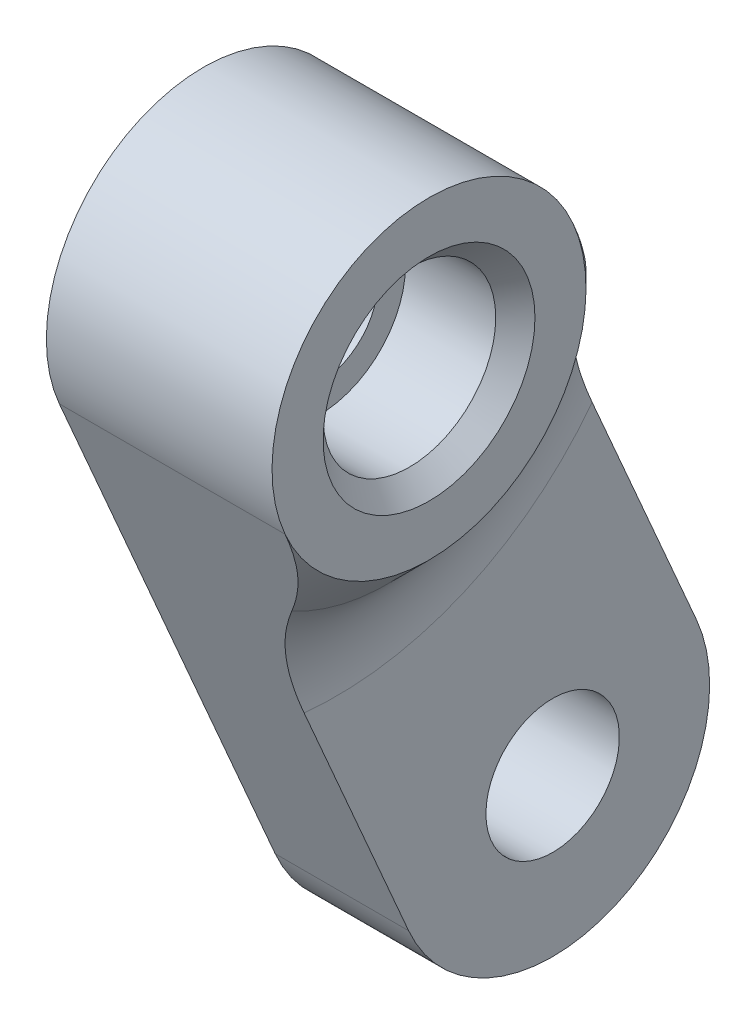
ISO-10303-21;
HEADER;
FILE_DESCRIPTION(('STEP AP214'),'2;1');
FILE_NAME('part.step','',(''),(''),'','','');
FILE_SCHEMA(('AUTOMOTIVE_DESIGN { 1 0 10303 214 1 1 1 1 }'));
ENDSEC;
DATA;
#1=APPLICATION_CONTEXT('core data for automotive mechanical design processes');
#2=APPLICATION_PROTOCOL_DEFINITION('international standard','automotive_design',2000,#1);
#3=PRODUCT_CONTEXT('',#1,'mechanical');
#4=PRODUCT('Part','Part','',(#3));
#5=PRODUCT_RELATED_PRODUCT_CATEGORY('part','',(#4));
#6=PRODUCT_DEFINITION_FORMATION('','',#4);
#7=PRODUCT_DEFINITION_CONTEXT('part definition',#1,'design');
#8=PRODUCT_DEFINITION('design','',#6,#7);
#9=PRODUCT_DEFINITION_SHAPE('','',#8);
#10=(LENGTH_UNIT() NAMED_UNIT(*) SI_UNIT(.MILLI.,.METRE.));
#11=(NAMED_UNIT(*) PLANE_ANGLE_UNIT() SI_UNIT($,.RADIAN.));
#12=(NAMED_UNIT(*) SI_UNIT($,.STERADIAN.) SOLID_ANGLE_UNIT());
#13=UNCERTAINTY_MEASURE_WITH_UNIT(LENGTH_MEASURE(1.E-05),#10,'distance_accuracy_value','');
#14=(GEOMETRIC_REPRESENTATION_CONTEXT(3) GLOBAL_UNCERTAINTY_ASSIGNED_CONTEXT((#13)) GLOBAL_UNIT_ASSIGNED_CONTEXT((#10,
#11,#12)) REPRESENTATION_CONTEXT('',''));
#15=CARTESIAN_POINT('',(0.,0.,0.));
#16=DIRECTION('',(0.,0.,1.));
#17=DIRECTION('',(1.,0.,0.));
#18=AXIS2_PLACEMENT_3D('',#15,#16,#17);
#19=CARTESIAN_POINT('',(-37.3463708891012,-52.7407828448025,-34.5));
#20=DIRECTION('',(1.,0.,0.));
#21=DIRECTION('',(0.,0.,-1.));
#22=AXIS2_PLACEMENT_3D('',#19,#20,#21);
#23=CYLINDRICAL_SURFACE('',#22,4.00000000000002);
#24=CARTESIAN_POINT('',(-31.5963708891012,-52.7407828448025,-34.5));
#25=DIRECTION('',(1.,0.,0.));
#26=DIRECTION('',(0.,0.,-1.));
#27=AXIS2_PLACEMENT_3D('',#24,#25,#26);
#28=CIRCLE('',#27,4.00000000000002);
#29=CARTESIAN_POINT('',(-31.5963708891012,-51.1487205335695,-38.1695146269162));
#30=VERTEX_POINT('',#29);
#31=CARTESIAN_POINT('',(-31.5963708891012,-54.3328451560355,-30.8304853730839));
#32=VERTEX_POINT('',#31);
#33=EDGE_CURVE('E138',#30,#32,#28,.T.);
#34=ORIENTED_EDGE('',*,*,#33,.F.);
#35=DIRECTION('',(1.,0.,0.));
#36=VECTOR('',#35,1.);
#37=CARTESIAN_POINT('',(-37.3463708891012,-51.1487205335695,-38.1695146269162));
#38=LINE('',#37,#36);
#39=CARTESIAN_POINT('',(-37.3463708891012,-51.1487205335695,-38.1695146269162));
#40=VERTEX_POINT('',#39);
#41=EDGE_CURVE('E121',#40,#30,#38,.T.);
#42=ORIENTED_EDGE('',*,*,#41,.F.);
#43=CARTESIAN_POINT('',(-37.3463708891012,-52.7407828448025,-34.5));
#44=DIRECTION('',(1.,0.,0.));
#45=DIRECTION('',(0.,0.,-1.));
#46=AXIS2_PLACEMENT_3D('',#43,#44,#45);
#47=CIRCLE('',#46,4.00000000000002);
#48=CARTESIAN_POINT('',(-37.3463708891012,-54.3328451560355,-30.8304853730839));
#49=VERTEX_POINT('',#48);
#50=EDGE_CURVE('E186',#40,#49,#47,.T.);
#51=ORIENTED_EDGE('',*,*,#50,.T.);
#52=DIRECTION('',(1.,0.,0.));
#53=VECTOR('',#52,1.);
#54=CARTESIAN_POINT('',(-37.3463708891012,-54.3328451560355,-30.8304853730839));
#55=LINE('',#54,#53);
#56=EDGE_CURVE('E119',#49,#32,#55,.T.);
#57=ORIENTED_EDGE('',*,*,#56,.T.);
#58=EDGE_LOOP('',(#34,#42,#51,#57));
#59=FACE_BOUND('',#58,.T.);
#60=ADVANCED_FACE('F39',(#59),#23,.T.);
#61=CARTESIAN_POINT('',(-37.3463708891012,-63.8255676052197,-43.6695146269162));
#62=DIRECTION('',(0.,0.398015577808248,-0.917378656729034));
#63=DIRECTION('',(0.,0.917378656729034,0.398015577808248));
#64=AXIS2_PLACEMENT_3D('',#61,#62,#63);
#65=PLANE('',#64);
#66=CARTESIAN_POINT('',(-33.9463708891012,-55.6730345265048,-40.1324417507112));
#67=CARTESIAN_POINT('',(-33.8489277180866,-55.5579052268867,-40.0824915427202));
#68=CARTESIAN_POINT('',(-33.7523680039819,-55.4421351506256,-40.0322633262057));
#69=CARTESIAN_POINT('',(-33.5614528925327,-55.2090226103541,-39.9311246941589));
#70=CARTESIAN_POINT('',(-33.4670981676063,-55.0916796834307,-39.8802140777863));
#71=CARTESIAN_POINT('',(-33.2803774265137,-54.8542941147552,-39.7772215418398));
#72=CARTESIAN_POINT('',(-33.1880321741052,-54.7342376799492,-39.7251336379864));
#73=CARTESIAN_POINT('',(-33.0067502317412,-54.4919875943403,-39.6200305738476));
#74=CARTESIAN_POINT('',(-32.9178132079351,-54.3697941545825,-39.5670155051267));
#75=CARTESIAN_POINT('',(-32.7479442023431,-54.1282089271162,-39.4622008975547));
#76=CARTESIAN_POINT('',(-32.6668323866894,-54.0089240033122,-39.4104477228723));
#77=CARTESIAN_POINT('',(-32.5095054409313,-53.7676712084378,-39.3057773451112));
#78=CARTESIAN_POINT('',(-32.4332896962277,-53.6457036767028,-39.2528602892573));
#79=CARTESIAN_POINT('',(-32.2872185919401,-53.3989689354775,-39.1458115042503));
#80=CARTESIAN_POINT('',(-32.2173480951185,-53.2742093239923,-39.0916830715816));
#81=CARTESIAN_POINT('',(-32.0854514185042,-53.0212719118965,-38.9819431844738));
#82=CARTESIAN_POINT('',(-32.0234220706421,-52.8930955172827,-38.9263323400429));
#83=CARTESIAN_POINT('',(-31.9105973694591,-52.6360642386155,-38.8148162805148));
#84=CARTESIAN_POINT('',(-31.8595745331869,-52.5072942763951,-38.7589479097592));
#85=CARTESIAN_POINT('',(-31.769316197952,-52.2463601314399,-38.6457385455425));
#86=CARTESIAN_POINT('',(-31.7300705278325,-52.1141989851626,-38.5883988694845));
#87=CARTESIAN_POINT('',(-31.6814586585337,-51.912515761195,-38.5008962179535));
#88=CARTESIAN_POINT('',(-31.6668747079175,-51.8440347995851,-38.4711849430028));
#89=CARTESIAN_POINT('',(-31.641636499267,-51.7064640556909,-38.4114982490527));
#90=CARTESIAN_POINT('',(-31.6309819323577,-51.6373743216976,-38.3815228510049));
#91=CARTESIAN_POINT('',(-31.6137947147839,-51.4984853654263,-38.3212642350277));
#92=CARTESIAN_POINT('',(-31.6072785531742,-51.4286844170439,-38.2909802682074));
#93=CARTESIAN_POINT('',(-31.5985574638926,-51.2888312470434,-38.2303033167025));
#94=CARTESIAN_POINT('',(-31.596354133403,-51.2187789419576,-38.1999102958043));
#95=CARTESIAN_POINT('',(-31.5963708891013,-51.1487205335695,-38.1695146269162));
#96=B_SPLINE_CURVE_WITH_KNOTS('',3,(#66,#67,#68,#69,#70,#71,#72,#73,#74,#75,#76,#77,#78,#79,#80,
#81,#82,#83,#84,#85,#86,#87,#88,#89,#90,#91,#92,#93,#94,#95),.UNSPECIFIED.,.F.,.F.,(4,2,2,2,2,2,
2,2,2,2,2,2,2,2,4),(0.,0.476670589431674,0.953484692577446,1.43395034873027,1.91436882028931,
2.37404232289717,2.83365800991208,3.29214673420408,3.75044961858605,4.19810665730534,
4.6453759642831,4.87346747222759,5.10154104687199,5.33051774872162,5.55957923208986),.UNSPECIFIED.);
#97=CARTESIAN_POINT('',(-32.657640726322,-53.9935489289193,-39.4037770650436));
#98=VERTEX_POINT('',#97);
#99=EDGE_CURVE('E131',#98,#30,#96,.T.);
#100=ORIENTED_EDGE('',*,*,#99,.F.);
#101=CARTESIAN_POINT('',(-32.657640726322,-53.9935489289193,-39.4037770650436));
#102=CARTESIAN_POINT('',(-32.7240839869354,-54.0930100945546,-39.4469294678377));
#103=CARTESIAN_POINT('',(-32.7890028193845,-54.193348000349,-39.4904622547168));
#104=CARTESIAN_POINT('',(-32.9152629941349,-54.395954491177,-39.5783654764923));
#105=CARTESIAN_POINT('',(-32.9766027905323,-54.498223885606,-39.6227362625546));
#106=CARTESIAN_POINT('',(-33.095351670272,-54.7051921857578,-39.7125319068817));
#107=CARTESIAN_POINT('',(-33.1527443241558,-54.8098990725733,-39.757960227838));
#108=CARTESIAN_POINT('',(-33.2627868840166,-55.0213665186227,-39.8497078798131));
#109=CARTESIAN_POINT('',(-33.3154374622535,-55.1281267841472,-39.8960270834026));
#110=CARTESIAN_POINT('',(-33.4625493488871,-55.4451362690559,-40.0335653969235));
#111=CARTESIAN_POINT('',(-33.5497614146984,-55.658281943327,-40.126041168057));
#112=CARTESIAN_POINT('',(-33.7005514431936,-56.0911936902439,-40.3138650484418));
#113=CARTESIAN_POINT('',(-33.7641732475921,-56.3109466530158,-40.4092074698195));
#114=CARTESIAN_POINT('',(-33.8356262267881,-56.6273984149007,-40.5465038086118));
#115=CARTESIAN_POINT('',(-33.8544842039094,-56.7220645866953,-40.5875758466294));
#116=CARTESIAN_POINT('',(-33.8871365534006,-56.9121339552418,-40.6700396896573));
#117=CARTESIAN_POINT('',(-33.9009311096096,-57.0075371251069,-40.7114314830024));
#118=CARTESIAN_POINT('',(-33.9346577263116,-57.2968892572502,-40.8369703269905));
#119=CARTESIAN_POINT('',(-33.9463978668547,-57.4916587093875,-40.9214733568607));
#120=CARTESIAN_POINT('',(-33.9463708891012,-57.686638523982,-41.0060676549703));
#121=B_SPLINE_CURVE_WITH_KNOTS('',3,(#101,#102,#103,#104,#105,#106,#107,#108,#109,#110,#111,
#112,#113,#114,#115,#116,#117,#118,#119,#120),.UNSPECIFIED.,.F.,.F.,(4,2,2,2,2,2,2,2,2,4),(0.,
0.381490480379838,0.763144537524138,1.14630146728859,1.5294039930653,2.27281898772027,
3.014845361955,3.3294470550642,3.64403732470939,4.28093987561737),.UNSPECIFIED.);
#122=CARTESIAN_POINT('',(-33.9463708891012,-57.686638523982,-41.0060676549703));
#123=VERTEX_POINT('',#122);
#124=EDGE_CURVE('E11',#98,#123,#121,.T.);
#125=ORIENTED_EDGE('',*,*,#124,.T.);
#126=DIRECTION('',(0.,0.917378656729031,0.398015577808256));
#127=VECTOR('',#126,1.);
#128=CARTESIAN_POINT('',(-33.9463708891012,-63.8255676052197,-43.6695146269162));
#129=LINE('',#128,#127);
#130=CARTESIAN_POINT('',(-33.9463708891012,-63.8255676052197,-43.6695146269162));
#131=VERTEX_POINT('',#130);
#132=EDGE_CURVE('E113',#131,#123,#129,.T.);
#133=ORIENTED_EDGE('',*,*,#132,.F.);
#134=DIRECTION('',(1.,0.,0.));
#135=VECTOR('',#134,1.);
#136=CARTESIAN_POINT('',(-37.3463708891012,-63.8255676052197,-43.6695146269162));
#137=LINE('',#136,#135);
#138=CARTESIAN_POINT('',(-37.3463708891012,-63.8255676052197,-43.6695146269162));
#139=VERTEX_POINT('',#138);
#140=EDGE_CURVE('E112',#139,#131,#137,.T.);
#141=ORIENTED_EDGE('',*,*,#140,.F.);
#142=DIRECTION('',(0.,0.917378656729034,0.398015577808248));
#143=VECTOR('',#142,1.);
#144=CARTESIAN_POINT('',(-37.3463708891012,-63.8255676052197,-43.6695146269162));
#145=LINE('',#144,#143);
#146=EDGE_CURVE('E124',#139,#40,#145,.T.);
#147=ORIENTED_EDGE('',*,*,#146,.T.);
#148=ORIENTED_EDGE('',*,*,#41,.T.);
#149=EDGE_LOOP('',(#100,#125,#133,#141,#147,#148));
#150=FACE_BOUND('',#149,.T.);
#151=ADVANCED_FACE('F146',(#150),#65,.T.);
#152=CARTESIAN_POINT('',(-37.3463708891012,-65.4176299164527,-40.));
#153=DIRECTION('',(1.,0.,0.));
#154=DIRECTION('',(0.,0.,-1.));
#155=AXIS2_PLACEMENT_3D('',#152,#153,#154);
#156=CYLINDRICAL_SURFACE('',#155,4.);
#157=CARTESIAN_POINT('',(-33.9463708891012,-65.4176299164527,-40.));
#158=DIRECTION('',(1.,0.,0.));
#159=DIRECTION('',(0.,0.,-1.));
#160=AXIS2_PLACEMENT_3D('',#157,#158,#159);
#161=CIRCLE('',#160,4.);
#162=CARTESIAN_POINT('',(-33.9463708891012,-67.0096922276857,-36.3304853730839));
#163=VERTEX_POINT('',#162);
#164=EDGE_CURVE('E99',#163,#131,#161,.T.);
#165=ORIENTED_EDGE('',*,*,#164,.F.);
#166=DIRECTION('',(1.,0.,0.));
#167=VECTOR('',#166,1.);
#168=CARTESIAN_POINT('',(-37.3463708891012,-67.0096922276857,-36.3304853730839));
#169=LINE('',#168,#167);
#170=CARTESIAN_POINT('',(-37.3463708891012,-67.0096922276857,-36.3304853730839));
#171=VERTEX_POINT('',#170);
#172=EDGE_CURVE('E110',#171,#163,#169,.T.);
#173=ORIENTED_EDGE('',*,*,#172,.F.);
#174=CARTESIAN_POINT('',(-37.3463708891012,-65.4176299164527,-40.));
#175=DIRECTION('',(1.,0.,0.));
#176=DIRECTION('',(0.,0.,-1.));
#177=AXIS2_PLACEMENT_3D('',#174,#175,#176);
#178=CIRCLE('',#177,4.);
#179=EDGE_CURVE('E354',#171,#139,#178,.T.);
#180=ORIENTED_EDGE('',*,*,#179,.T.);
#181=ORIENTED_EDGE('',*,*,#140,.T.);
#182=EDGE_LOOP('',(#165,#173,#180,#181));
#183=FACE_BOUND('',#182,.T.);
#184=ADVANCED_FACE('F108',(#183),#156,.T.);
#185=CARTESIAN_POINT('',(-37.3463708891012,-54.3328451560355,-30.8304853730839));
#186=DIRECTION('',(0.,-0.398015577808251,0.917378656729033));
#187=DIRECTION('',(0.,-0.917378656729033,-0.398015577808251));
#188=AXIS2_PLACEMENT_3D('',#185,#186,#187);
#189=PLANE('',#188);
#190=DIRECTION('',(0.,-0.917378656729033,-0.398015577808251));
#191=VECTOR('',#190,1.);
#192=CARTESIAN_POINT('',(-33.9463708891012,-58.8571591489708,-32.7934124968789));
#193=LINE('',#192,#191);
#194=CARTESIAN_POINT('',(-33.9463708891012,-60.870763146448,-33.667038401138));
#195=VERTEX_POINT('',#194);
#196=EDGE_CURVE('E95',#195,#163,#193,.T.);
#197=ORIENTED_EDGE('',*,*,#196,.F.);
#198=CARTESIAN_POINT('',(-33.9463708891012,-60.870763146448,-33.667038401138));
#199=CARTESIAN_POINT('',(-33.946396437014,-60.7100533014849,-33.5973125345798));
#200=CARTESIAN_POINT('',(-33.9384185398531,-60.5494237841519,-33.5276215191137));
#201=CARTESIAN_POINT('',(-33.9075159583361,-60.2295511808856,-33.3888410078382));
#202=CARTESIAN_POINT('',(-33.8846082852863,-60.0703067257935,-33.3197509180031));
#203=CARTESIAN_POINT('',(-33.8254483159732,-59.7569557027335,-33.1837998714149));
#204=CARTESIAN_POINT('',(-33.7894481092014,-59.6028084511302,-33.1169212635855));
#205=CARTESIAN_POINT('',(-33.7051681401346,-59.2973550941933,-32.984396712831));
#206=CARTESIAN_POINT('',(-33.6568860944565,-59.1460495227949,-32.9187510015601));
#207=CARTESIAN_POINT('',(-33.5461169584604,-58.8382078638296,-32.7851902577301));
#208=CARTESIAN_POINT('',(-33.4829721715327,-58.6818720346455,-32.7173621096383));
#209=CARTESIAN_POINT('',(-33.3456930760897,-58.37328377521,-32.5834774443661));
#210=CARTESIAN_POINT('',(-33.2715552601813,-58.2210326665899,-32.517421500591));
#211=CARTESIAN_POINT('',(-33.1121978606372,-57.9177205919843,-32.3858259704957));
#212=CARTESIAN_POINT('',(-33.0267842332427,-57.7667461944647,-32.320323942928));
#213=CARTESIAN_POINT('',(-32.8478704436733,-57.4691012240445,-32.1911871529946));
#214=CARTESIAN_POINT('',(-32.7543798594971,-57.322425822419,-32.1275502956293));
#215=CARTESIAN_POINT('',(-32.657640726322,-57.1776735513854,-32.0647478112114));
#216=B_SPLINE_CURVE_WITH_KNOTS('',3,(#198,#199,#200,#201,#202,#203,#204,#205,#206,#207,#208,
#209,#210,#211,#212,#213,#214,#215),.UNSPECIFIED.,.F.,.F.,(4,2,2,2,2,2,2,2,4),(0.,
0.525241781633167,1.04988613537208,1.56492168009929,2.08005304793708,2.62483657319557,
3.16979429047495,3.72579003905963,4.28113528401284),.UNSPECIFIED.);
#217=CARTESIAN_POINT('',(-32.657640726322,-57.1776735513854,-32.0647478112114));
#218=VERTEX_POINT('',#217);
#219=EDGE_CURVE('E53',#195,#218,#216,.T.);
#220=ORIENTED_EDGE('',*,*,#219,.T.);
#221=CARTESIAN_POINT('',(-33.9463708891012,-58.8571591489708,-32.7934124968789));
#222=CARTESIAN_POINT('',(-33.8489277180866,-58.7420298493527,-32.7434622888879));
#223=CARTESIAN_POINT('',(-33.7523680039819,-58.6262597730916,-32.6932340723734));
#224=CARTESIAN_POINT('',(-33.5614528925327,-58.3931472328201,-32.5920954403266));
#225=CARTESIAN_POINT('',(-33.4670981676062,-58.2758043058967,-32.541184823954));
#226=CARTESIAN_POINT('',(-33.2803774265136,-58.0384187372212,-32.4381922880075));
#227=CARTESIAN_POINT('',(-33.1880321741052,-57.9183623024153,-32.3861043841541));
#228=CARTESIAN_POINT('',(-33.0067502317412,-57.6761122168063,-32.2810013200153));
#229=CARTESIAN_POINT('',(-32.9178132079351,-57.5539187770486,-32.2279862512944));
#230=CARTESIAN_POINT('',(-32.7479442023431,-57.3123335495822,-32.1231716437225));
#231=CARTESIAN_POINT('',(-32.6668323866894,-57.1930486257783,-32.07141846904));
#232=CARTESIAN_POINT('',(-32.5095054409312,-56.9517958309038,-31.9667480912789));
#233=CARTESIAN_POINT('',(-32.4332896962276,-56.8298282991689,-31.913831035425));
#234=CARTESIAN_POINT('',(-32.28721859194,-56.5830935579435,-31.806782250418));
#235=CARTESIAN_POINT('',(-32.2173480951185,-56.4583339464583,-31.7526538177494));
#236=CARTESIAN_POINT('',(-32.0854514185042,-56.2053965343625,-31.6429139306415));
#237=CARTESIAN_POINT('',(-32.0234220706421,-56.0772201397488,-31.5873030862106));
#238=CARTESIAN_POINT('',(-31.9105973694591,-55.8201888610815,-31.4757870266825));
#239=CARTESIAN_POINT('',(-31.8595745331868,-55.6914188988612,-31.4199186559269));
#240=CARTESIAN_POINT('',(-31.7693161979519,-55.4304847539059,-31.3067092917102));
#241=CARTESIAN_POINT('',(-31.7300705278325,-55.2983236076286,-31.2493696156522));
#242=CARTESIAN_POINT('',(-31.6814586585337,-55.096640383661,-31.1618669641212));
#243=CARTESIAN_POINT('',(-31.6668747079174,-55.0281594220511,-31.1321556891705));
#244=CARTESIAN_POINT('',(-31.641636499267,-54.890588678157,-31.0724689952204));
#245=CARTESIAN_POINT('',(-31.6309819323577,-54.8214989441636,-31.0424935971726));
#246=CARTESIAN_POINT('',(-31.6137947147839,-54.6826099878924,-30.9822349811954));
#247=CARTESIAN_POINT('',(-31.6072785531741,-54.6128090395099,-30.9519510143752));
#248=CARTESIAN_POINT('',(-31.5985574638925,-54.4729558695094,-30.8912740628702));
#249=CARTESIAN_POINT('',(-31.596354133403,-54.4029035644236,-30.860881041972));
#250=CARTESIAN_POINT('',(-31.5963708891012,-54.3328451560355,-30.8304853730839));
#251=B_SPLINE_CURVE_WITH_KNOTS('',3,(#221,#222,#223,#224,#225,#226,#227,#228,#229,#230,#231,
#232,#233,#234,#235,#236,#237,#238,#239,#240,#241,#242,#243,#244,#245,#246,#247,#248,#249,#250),
.UNSPECIFIED.,.F.,.F.,(4,2,2,2,2,2,2,2,2,2,2,2,2,2,4),(0.,0.476670589431674,0.953484692577448,
1.43395034873027,1.91436882028932,2.37404232289719,2.83365800991209,3.29214673420408,
3.75044961858604,4.19810665730533,4.6453759642831,4.87346747222761,5.10154104687201,
5.33051774872163,5.55957923208988),.UNSPECIFIED.);
#252=EDGE_CURVE('E139',#218,#32,#251,.T.);
#253=ORIENTED_EDGE('',*,*,#252,.T.);
#254=ORIENTED_EDGE('',*,*,#56,.F.);
#255=DIRECTION('',(0.,-0.917378656729033,-0.398015577808251));
#256=VECTOR('',#255,1.);
#257=CARTESIAN_POINT('',(-37.3463708891012,-54.3328451560355,-30.8304853730839));
#258=LINE('',#257,#256);
#259=EDGE_CURVE('E118',#49,#171,#258,.T.);
#260=ORIENTED_EDGE('',*,*,#259,.T.);
#261=ORIENTED_EDGE('',*,*,#172,.T.);
#262=EDGE_LOOP('',(#197,#220,#253,#254,#260,#261));
#263=FACE_BOUND('',#262,.T.);
#264=ADVANCED_FACE('F116',(#263),#189,.T.);
#265=CARTESIAN_POINT('',(-37.3463708891012,-52.7407828448025,-34.5));
#266=DIRECTION('',(1.,0.,0.));
#267=DIRECTION('',(0.,0.,-1.));
#268=AXIS2_PLACEMENT_3D('',#265,#266,#267);
#269=PLANE('',#268);
#270=CARTESIAN_POINT('',(-37.3463708891012,-52.7407828448025,-34.5));
#271=DIRECTION('',(1.,0.,0.));
#272=DIRECTION('',(0.,0.,-1.));
#273=AXIS2_PLACEMENT_3D('',#270,#271,#272);
#274=CIRCLE('',#273,1.50000000000002);
#275=CARTESIAN_POINT('',(-37.3463708891012,-52.7407828448025,-36.));
#276=VERTEX_POINT('',#275);
#277=EDGE_CURVE('E341',#276,#276,#274,.T.);
#278=ORIENTED_EDGE('',*,*,#277,.T.);
#279=EDGE_LOOP('',(#278));
#280=FACE_BOUND('',#279,.T.);
#281=CARTESIAN_POINT('',(-37.3463708891012,-65.4176299164527,-40.));
#282=DIRECTION('',(-1.,0.,0.));
#283=DIRECTION('',(0.,0.,1.));
#284=AXIS2_PLACEMENT_3D('',#281,#282,#283);
#285=CIRCLE('',#284,1.70000000000001);
#286=CARTESIAN_POINT('',(-37.3463708891012,-65.4176299164527,-38.3));
#287=VERTEX_POINT('',#286);
#288=EDGE_CURVE('E346',#287,#287,#285,.T.);
#289=ORIENTED_EDGE('',*,*,#288,.F.);
#290=EDGE_LOOP('',(#289));
#291=FACE_BOUND('',#290,.T.);
#292=ORIENTED_EDGE('',*,*,#50,.F.);
#293=ORIENTED_EDGE('',*,*,#146,.F.);
#294=ORIENTED_EDGE('',*,*,#179,.F.);
#295=ORIENTED_EDGE('',*,*,#259,.F.);
#296=EDGE_LOOP('',(#292,#293,#294,#295));
#297=FACE_BOUND('',#296,.T.);
#298=ADVANCED_FACE('F202',(#280,#291,#297),#269,.F.);
#299=CARTESIAN_POINT('',(-31.5963708891012,-52.7407828448025,-34.5));
#300=DIRECTION('',(1.,0.,0.));
#301=DIRECTION('',(0.,0.,-1.));
#302=AXIS2_PLACEMENT_3D('',#299,#300,#301);
#303=PLANE('',#302);
#304=CARTESIAN_POINT('',(-31.5963708891012,-52.7407828448025,-34.5));
#305=DIRECTION('',(1.,0.,0.));
#306=DIRECTION('',(0.,0.,-1.));
#307=AXIS2_PLACEMENT_3D('',#304,#305,#306);
#308=CIRCLE('',#307,2.70000000000008);
#309=CARTESIAN_POINT('',(-31.5963708891012,-52.7407828448025,-37.2000000000001));
#310=VERTEX_POINT('',#309);
#311=EDGE_CURVE('E193',#310,#310,#308,.F.);
#312=ORIENTED_EDGE('',*,*,#311,.T.);
#313=EDGE_LOOP('',(#312));
#314=FACE_BOUND('',#313,.T.);
#315=CARTESIAN_POINT('',(-31.5963708891012,-52.7407828448025,-34.5));
#316=DIRECTION('',(1.,0.,0.));
#317=DIRECTION('',(0.,0.,-1.));
#318=AXIS2_PLACEMENT_3D('',#315,#316,#317);
#319=CIRCLE('',#318,3.99999999999999);
#320=EDGE_CURVE('E104',#30,#32,#319,.F.);
#321=ORIENTED_EDGE('',*,*,#320,.F.);
#322=ORIENTED_EDGE('',*,*,#33,.T.);
#323=EDGE_LOOP('',(#321,#322));
#324=FACE_BOUND('',#323,.T.);
#325=ADVANCED_FACE('F154',(#314,#324),#303,.T.);
#326=CARTESIAN_POINT('',(-33.9463708891012,-52.7407828448025,-34.5));
#327=DIRECTION('',(-1.,0.,0.));
#328=DIRECTION('',(0.,0.,1.));
#329=AXIS2_PLACEMENT_3D('',#326,#327,#328);
#330=CONICAL_SURFACE('',#329,6.35,0.785398163397451);
#331=ORIENTED_EDGE('',*,*,#252,.F.);
#332=CARTESIAN_POINT('',(-32.657640726322,-52.7407828448025,-34.5));
#333=DIRECTION('',(-1.,0.,0.));
#334=DIRECTION('',(0.,0.,1.));
#335=AXIS2_PLACEMENT_3D('',#332,#333,#334);
#336=CIRCLE('',#335,5.06126983722081);
#337=EDGE_CURVE('E60',#218,#98,#336,.F.);
#338=ORIENTED_EDGE('',*,*,#337,.T.);
#339=ORIENTED_EDGE('',*,*,#99,.T.);
#340=ORIENTED_EDGE('',*,*,#320,.T.);
#341=EDGE_LOOP('',(#331,#338,#339,#340));
#342=FACE_BOUND('',#341,.T.);
#343=ADVANCED_FACE('F150',(#342),#330,.T.);
#344=CARTESIAN_POINT('',(-33.9463708891012,-52.7407828448025,-34.5));
#345=DIRECTION('',(-1.,0.,0.));
#346=DIRECTION('',(0.,0.,1.));
#347=AXIS2_PLACEMENT_3D('',#344,#345,#346);
#348=PLANE('',#347);
#349=CARTESIAN_POINT('',(-33.9463708891012,-65.4176299164527,-40.));
#350=DIRECTION('',(-1.,0.,0.));
#351=DIRECTION('',(0.,0.,1.));
#352=AXIS2_PLACEMENT_3D('',#349,#350,#351);
#353=CIRCLE('',#352,1.70000000000001);
#354=CARTESIAN_POINT('',(-33.9463708891012,-65.4176299164527,-38.3));
#355=VERTEX_POINT('',#354);
#356=EDGE_CURVE('E130',#355,#355,#353,.T.);
#357=ORIENTED_EDGE('',*,*,#356,.T.);
#358=EDGE_LOOP('',(#357));
#359=FACE_BOUND('',#358,.T.);
#360=ORIENTED_EDGE('',*,*,#132,.T.);
#361=CARTESIAN_POINT('',(-33.9463708891012,-52.7407828448025,-34.5));
#362=DIRECTION('',(-1.,0.,0.));
#363=DIRECTION('',(0.,0.,1.));
#364=AXIS2_PLACEMENT_3D('',#361,#362,#363);
#365=CIRCLE('',#364,8.17253967444161);
#366=EDGE_CURVE('E102',#123,#195,#365,.T.);
#367=ORIENTED_EDGE('',*,*,#366,.T.);
#368=ORIENTED_EDGE('',*,*,#196,.T.);
#369=ORIENTED_EDGE('',*,*,#164,.T.);
#370=EDGE_LOOP('',(#360,#367,#368,#369));
#371=FACE_BOUND('',#370,.T.);
#372=ADVANCED_FACE('F98',(#359,#371),#348,.F.);
#373=CARTESIAN_POINT('',(-37.3463708891012,-65.4176299164527,-40.));
#374=DIRECTION('',(-1.,0.,0.));
#375=DIRECTION('',(0.,0.,1.));
#376=AXIS2_PLACEMENT_3D('',#373,#374,#375);
#377=CYLINDRICAL_SURFACE('',#376,1.70000000000001);
#378=ORIENTED_EDGE('',*,*,#288,.T.);
#379=EDGE_LOOP('',(#378));
#380=FACE_BOUND('',#379,.T.);
#381=ORIENTED_EDGE('',*,*,#356,.F.);
#382=EDGE_LOOP('',(#381));
#383=FACE_BOUND('',#382,.T.);
#384=ADVANCED_FACE('F240',(#380,#383),#377,.F.);
#385=CARTESIAN_POINT('',(-31.5963708891012,-52.7407828448025,-34.5));
#386=DIRECTION('',(1.,0.,0.));
#387=DIRECTION('',(0.,0.,-1.));
#388=AXIS2_PLACEMENT_3D('',#385,#386,#387);
#389=CYLINDRICAL_SURFACE('',#388,1.50000000000002);
#390=ORIENTED_EDGE('',*,*,#277,.F.);
#391=EDGE_LOOP('',(#390));
#392=FACE_BOUND('',#391,.T.);
#393=CARTESIAN_POINT('',(-34.3963708891011,-52.7407828448025,-34.5));
#394=DIRECTION('',(1.,0.,0.));
#395=DIRECTION('',(0.,0.,-1.));
#396=AXIS2_PLACEMENT_3D('',#393,#394,#395);
#397=CIRCLE('',#396,1.50000000000002);
#398=CARTESIAN_POINT('',(-34.3963708891011,-52.7407828448025,-36.));
#399=VERTEX_POINT('',#398);
#400=EDGE_CURVE('E335',#399,#399,#397,.T.);
#401=ORIENTED_EDGE('',*,*,#400,.T.);
#402=EDGE_LOOP('',(#401));
#403=FACE_BOUND('',#402,.T.);
#404=ADVANCED_FACE('F248',(#392,#403),#389,.F.);
#405=CARTESIAN_POINT('',(-34.3963708891011,-51.2407828448025,-34.5));
#406=DIRECTION('',(-1.,0.,0.));
#407=DIRECTION('',(0.,0.,1.));
#408=AXIS2_PLACEMENT_3D('',#405,#406,#407);
#409=PLANE('',#408);
#410=ORIENTED_EDGE('',*,*,#400,.F.);
#411=EDGE_LOOP('',(#410));
#412=FACE_BOUND('',#411,.T.);
#413=CARTESIAN_POINT('',(-34.3963708891011,-52.7407828448025,-34.5));
#414=DIRECTION('',(1.,0.,0.));
#415=DIRECTION('',(0.,0.,-1.));
#416=AXIS2_PLACEMENT_3D('',#413,#414,#415);
#417=CIRCLE('',#416,2.20000000000001);
#418=CARTESIAN_POINT('',(-34.3963708891011,-52.7407828448025,-36.7));
#419=VERTEX_POINT('',#418);
#420=EDGE_CURVE('E338',#419,#419,#417,.T.);
#421=ORIENTED_EDGE('',*,*,#420,.T.);
#422=EDGE_LOOP('',(#421));
#423=FACE_BOUND('',#422,.T.);
#424=ADVANCED_FACE('F168',(#412,#423),#409,.F.);
#425=CARTESIAN_POINT('',(-31.5963708891012,-52.7407828448025,-34.5));
#426=DIRECTION('',(1.,0.,0.));
#427=DIRECTION('',(0.,0.,-1.));
#428=AXIS2_PLACEMENT_3D('',#425,#426,#427);
#429=CYLINDRICAL_SURFACE('',#428,2.20000000000001);
#430=CARTESIAN_POINT('',(-32.0963708891013,-52.7407828448025,-34.5));
#431=DIRECTION('',(1.,0.,0.));
#432=DIRECTION('',(0.,0.,-1.));
#433=AXIS2_PLACEMENT_3D('',#430,#431,#432);
#434=CIRCLE('',#433,2.20000000000001);
#435=CARTESIAN_POINT('',(-32.0963708891013,-52.7407828448025,-36.7));
#436=VERTEX_POINT('',#435);
#437=EDGE_CURVE('E191',#436,#436,#434,.T.);
#438=ORIENTED_EDGE('',*,*,#437,.T.);
#439=EDGE_LOOP('',(#438));
#440=FACE_BOUND('',#439,.T.);
#441=ORIENTED_EDGE('',*,*,#420,.F.);
#442=EDGE_LOOP('',(#441));
#443=FACE_BOUND('',#442,.T.);
#444=ADVANCED_FACE('F161',(#440,#443),#429,.F.);
#445=CARTESIAN_POINT('',(-32.0963708891013,-52.7407828448025,-34.5));
#446=DIRECTION('',(1.,0.,0.));
#447=DIRECTION('',(0.,0.,-1.));
#448=AXIS2_PLACEMENT_3D('',#445,#446,#447);
#449=CONICAL_SURFACE('',#448,2.20000000000001,0.785398163397455);
#450=ORIENTED_EDGE('',*,*,#311,.F.);
#451=EDGE_LOOP('',(#450));
#452=FACE_BOUND('',#451,.T.);
#453=ORIENTED_EDGE('',*,*,#437,.F.);
#454=EDGE_LOOP('',(#453));
#455=FACE_BOUND('',#454,.T.);
#456=ADVANCED_FACE('F156',(#452,#455),#449,.F.);
#457=CARTESIAN_POINT('',(-29.5463708891012,-52.7407828448025,-34.5));
#458=DIRECTION('',(-1.,0.,0.));
#459=DIRECTION('',(0.,0.,1.));
#460=AXIS2_PLACEMENT_3D('',#457,#458,#459);
#461=TOROIDAL_SURFACE('',#460,8.17253967444161,4.4);
#462=ORIENTED_EDGE('',*,*,#124,.F.);
#463=ORIENTED_EDGE('',*,*,#337,.F.);
#464=ORIENTED_EDGE('',*,*,#219,.F.);
#465=ORIENTED_EDGE('',*,*,#366,.F.);
#466=EDGE_LOOP('',(#462,#463,#464,#465));
#467=FACE_BOUND('',#466,.T.);
#468=ADVANCED_FACE('F41',(#467),#461,.F.);
#469=CLOSED_SHELL('',(#60,#151,#184,#264,#298,#325,#343,#372,#384,#404,#424,#444,#456,#468));
#470=MANIFOLD_SOLID_BREP('B2',#469);
#471=ADVANCED_BREP_SHAPE_REPRESENTATION('',(#18,#470),#14);
#472=SHAPE_DEFINITION_REPRESENTATION(#9,#471);
ENDSEC;
END-ISO-10303-21;
